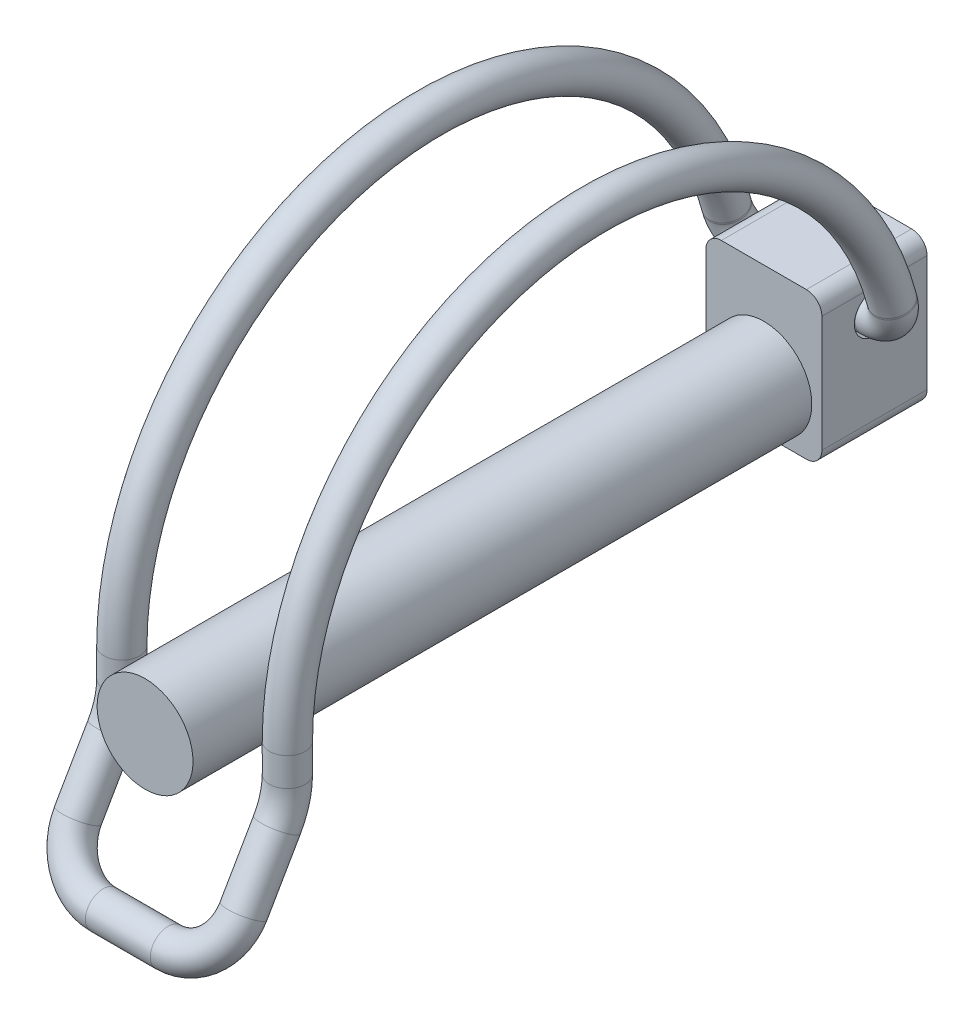
ISO-10303-21;
HEADER;
FILE_DESCRIPTION(('STEP AP214'),'2;1');
FILE_NAME('part.step','',(''),(''),'','','');
FILE_SCHEMA(('AUTOMOTIVE_DESIGN { 1 0 10303 214 1 1 1 1 }'));
ENDSEC;
DATA;
#1=APPLICATION_CONTEXT('core data for automotive mechanical design processes');
#2=APPLICATION_PROTOCOL_DEFINITION('international standard','automotive_design',2000,#1);
#3=PRODUCT_CONTEXT('',#1,'mechanical');
#4=PRODUCT('Part','Part','',(#3));
#5=PRODUCT_RELATED_PRODUCT_CATEGORY('part','',(#4));
#6=PRODUCT_DEFINITION_FORMATION('','',#4);
#7=PRODUCT_DEFINITION_CONTEXT('part definition',#1,'design');
#8=PRODUCT_DEFINITION('design','',#6,#7);
#9=PRODUCT_DEFINITION_SHAPE('','',#8);
#10=(LENGTH_UNIT() NAMED_UNIT(*) SI_UNIT(.MILLI.,.METRE.));
#11=(NAMED_UNIT(*) PLANE_ANGLE_UNIT() SI_UNIT($,.RADIAN.));
#12=(NAMED_UNIT(*) SI_UNIT($,.STERADIAN.) SOLID_ANGLE_UNIT());
#13=UNCERTAINTY_MEASURE_WITH_UNIT(LENGTH_MEASURE(1.E-05),#10,'distance_accuracy_value','');
#14=(GEOMETRIC_REPRESENTATION_CONTEXT(3) GLOBAL_UNCERTAINTY_ASSIGNED_CONTEXT((#13)) GLOBAL_UNIT_ASSIGNED_CONTEXT((#10,
#11,#12)) REPRESENTATION_CONTEXT('',''));
#15=CARTESIAN_POINT('',(0.,0.,0.));
#16=DIRECTION('',(0.,0.,1.));
#17=DIRECTION('',(1.,0.,0.));
#18=AXIS2_PLACEMENT_3D('',#15,#16,#17);
#19=CARTESIAN_POINT('',(4.6355,6.8479338589581,-3.75920968162365));
#20=DIRECTION('',(0.,0.258819045102516,-0.96592582628907));
#21=DIRECTION('',(0.,0.96592582628907,0.258819045102516));
#22=AXIS2_PLACEMENT_3D('',#19,#20,#21);
#23=TOROIDAL_SURFACE('',#22,2.159,1.4605);
#24=CARTESIAN_POINT('',(6.7945,6.8479338589581,-3.75920968162366));
#25=DIRECTION('',(0.,0.965925826289069,0.258819045102517));
#26=DIRECTION('',(0.258819045102516,0.249999999999996,-0.933012701892222));
#27=AXIS2_PLACEMENT_3D('',#24,#25,#26);
#28=CIRCLE('',#27,1.4605);
#29=CARTESIAN_POINT('',(8.255,6.84793385895809,-3.75920968162366));
#30=VERTEX_POINT('',#29);
#31=EDGE_CURVE('E46',#30,#30,#28,.T.);
#32=CARTESIAN_POINT('',(4.6355,4.7625,-4.31799999999999));
#33=DIRECTION('',(1.,0.,0.));
#34=DIRECTION('',(0.,0.,-1.));
#35=AXIS2_PLACEMENT_3D('',#32,#33,#34);
#36=CIRCLE('',#35,1.4605);
#37=CARTESIAN_POINT('',(4.6355,3.35176533070481,-4.69600521537221));
#38=VERTEX_POINT('',#37);
#39=EDGE_CURVE('E11',#38,#38,#36,.T.);
#40=CARTESIAN_POINT('',(4.6355,6.8479338589581,-3.75920968162365));
#41=DIRECTION('',(0.,0.258819045102516,-0.96592582628907));
#42=DIRECTION('',(0.,0.96592582628907,0.258819045102516));
#43=AXIS2_PLACEMENT_3D('',#40,#41,#42);
#44=CIRCLE('',#43,3.6195);
#45=EDGE_CURVE('',#30,#38,#44,.T.);
#46=ORIENTED_EDGE('',*,*,#31,.F.);
#47=ORIENTED_EDGE('',*,*,#39,.T.);
#48=ORIENTED_EDGE('',*,*,#45,.T.);
#49=ORIENTED_EDGE('',*,*,#45,.F.);
#50=EDGE_LOOP('',(#46,#48,#47,#49));
#51=FACE_BOUND('',#50,.T.);
#52=ADVANCED_FACE('F40',(#51),#23,.T.);
#53=CARTESIAN_POINT('',(6.7945,6.97060643889681,-3.72633966289564));
#54=DIRECTION('',(0.,-0.965925826289087,-0.258819045102452));
#55=DIRECTION('',(0.,0.258819045102452,-0.965925826289087));
#56=AXIS2_PLACEMENT_3D('',#53,#54,#55);
#57=CYLINDRICAL_SURFACE('',#56,1.4605);
#58=CARTESIAN_POINT('',(6.7945,6.97060643889681,-3.72633966289564));
#59=DIRECTION('',(0.,0.965925826289069,0.258819045102517));
#60=DIRECTION('',(0.258819045102516,0.249999999999996,-0.933012701892222));
#61=AXIS2_PLACEMENT_3D('',#58,#59,#60);
#62=CIRCLE('',#61,1.4605);
#63=CARTESIAN_POINT('',(6.7945,7.34861165426904,-5.13707433219084));
#64=VERTEX_POINT('',#63);
#65=EDGE_CURVE('E50',#64,#64,#62,.T.);
#66=ORIENTED_EDGE('',*,*,#65,.F.);
#67=EDGE_LOOP('',(#66));
#68=FACE_BOUND('',#67,.T.);
#69=ORIENTED_EDGE('',*,*,#31,.T.);
#70=EDGE_LOOP('',(#69));
#71=FACE_BOUND('',#70,.T.);
#72=ADVANCED_FACE('F174',(#68,#71),#57,.T.);
#73=CARTESIAN_POINT('',(6.7945,0.435792524931649,20.661917882031));
#74=DIRECTION('',(-1.,0.,0.));
#75=DIRECTION('',(0.,0.,1.));
#76=AXIS2_PLACEMENT_3D('',#73,#74,#75);
#77=TOROIDAL_SURFACE('',#76,25.248582117969,1.4605);
#78=CARTESIAN_POINT('',(6.7945,0.43579252493166,45.9105));
#79=DIRECTION('',(0.,-1.,0.));
#80=DIRECTION('',(0.258819045102516,0.,0.965925826289069));
#81=AXIS2_PLACEMENT_3D('',#78,#79,#80);
#82=CIRCLE('',#81,1.4605);
#83=CARTESIAN_POINT('',(6.7945,0.435792524931661,47.371));
#84=VERTEX_POINT('',#83);
#85=EDGE_CURVE('E54',#84,#84,#82,.T.);
#86=CARTESIAN_POINT('',(6.7945,0.435792524931649,20.661917882031));
#87=DIRECTION('',(-1.,0.,0.));
#88=DIRECTION('',(0.,0.,1.));
#89=AXIS2_PLACEMENT_3D('',#86,#87,#88);
#90=CIRCLE('',#89,26.709082117969);
#91=EDGE_CURVE('',#84,#64,#90,.T.);
#92=ORIENTED_EDGE('',*,*,#85,.F.);
#93=ORIENTED_EDGE('',*,*,#65,.T.);
#94=ORIENTED_EDGE('',*,*,#91,.T.);
#95=ORIENTED_EDGE('',*,*,#91,.F.);
#96=EDGE_LOOP('',(#92,#94,#93,#95));
#97=FACE_BOUND('',#96,.T.);
#98=ADVANCED_FACE('F168',(#97),#77,.T.);
#99=CARTESIAN_POINT('',(6.7945,-1.905,45.9105));
#100=DIRECTION('',(0.,1.,0.));
#101=DIRECTION('',(0.,0.,1.));
#102=AXIS2_PLACEMENT_3D('',#99,#100,#101);
#103=CYLINDRICAL_SURFACE('',#102,1.4605);
#104=CARTESIAN_POINT('',(6.7945,-1.905,45.9105));
#105=DIRECTION('',(0.,-1.,0.));
#106=DIRECTION('',(0.258819045102516,0.,0.965925826289069));
#107=AXIS2_PLACEMENT_3D('',#104,#105,#106);
#108=CIRCLE('',#107,1.4605);
#109=CARTESIAN_POINT('',(6.7945,-1.905,44.45));
#110=VERTEX_POINT('',#109);
#111=EDGE_CURVE('E59',#110,#110,#108,.T.);
#112=ORIENTED_EDGE('',*,*,#111,.F.);
#113=EDGE_LOOP('',(#112));
#114=FACE_BOUND('',#113,.T.);
#115=ORIENTED_EDGE('',*,*,#85,.T.);
#116=EDGE_LOOP('',(#115));
#117=FACE_BOUND('',#116,.T.);
#118=ADVANCED_FACE('F162',(#114,#117),#103,.T.);
#119=CARTESIAN_POINT('',(6.7945,-1.90500000000001,52.2605));
#120=DIRECTION('',(1.,0.,0.));
#121=DIRECTION('',(0.,0.,-1.));
#122=AXIS2_PLACEMENT_3D('',#119,#120,#121);
#123=TOROIDAL_SURFACE('',#122,6.35000000000001,1.4605);
#124=CARTESIAN_POINT('',(6.7945,-5.08000000000002,46.7612386859688));
#125=DIRECTION('',(0.,-0.866025403784439,0.5));
#126=DIRECTION('',(0.258819045102516,0.482962913144536,0.836516303737808));
#127=AXIS2_PLACEMENT_3D('',#124,#125,#126);
#128=CIRCLE('',#127,1.4605);
#129=CARTESIAN_POINT('',(6.7945,-5.81025000000002,45.4964085837416));
#130=VERTEX_POINT('',#129);
#131=EDGE_CURVE('E62',#130,#130,#128,.T.);
#132=CARTESIAN_POINT('',(6.7945,-1.90500000000001,52.2605));
#133=DIRECTION('',(1.,0.,0.));
#134=DIRECTION('',(0.,0.,-1.));
#135=AXIS2_PLACEMENT_3D('',#132,#133,#134);
#136=CIRCLE('',#135,7.81050000000001);
#137=EDGE_CURVE('',#130,#110,#136,.T.);
#138=ORIENTED_EDGE('',*,*,#131,.F.);
#139=ORIENTED_EDGE('',*,*,#111,.T.);
#140=ORIENTED_EDGE('',*,*,#137,.T.);
#141=ORIENTED_EDGE('',*,*,#137,.F.);
#142=EDGE_LOOP('',(#138,#140,#139,#141));
#143=FACE_BOUND('',#142,.T.);
#144=ADVANCED_FACE('F156',(#143),#123,.T.);
#145=CARTESIAN_POINT('',(6.7945,-9.84249999999998,49.5108693429844));
#146=DIRECTION('',(0.,0.866025403784435,-0.500000000000007));
#147=DIRECTION('',(0.,0.500000000000007,0.866025403784435));
#148=AXIS2_PLACEMENT_3D('',#145,#146,#147);
#149=CYLINDRICAL_SURFACE('',#148,1.4605);
#150=CARTESIAN_POINT('',(6.7945,-9.84249999999998,49.5108693429844));
#151=DIRECTION('',(0.,-0.866025403784439,0.5));
#152=DIRECTION('',(0.258819045102516,0.482962913144536,0.836516303737808));
#153=AXIS2_PLACEMENT_3D('',#150,#151,#152);
#154=CIRCLE('',#153,1.4605);
#155=CARTESIAN_POINT('',(8.255,-9.84249999999998,49.5108693429844));
#156=VERTEX_POINT('',#155);
#157=EDGE_CURVE('E65',#156,#156,#154,.T.);
#158=ORIENTED_EDGE('',*,*,#157,.F.);
#159=EDGE_LOOP('',(#158));
#160=FACE_BOUND('',#159,.T.);
#161=ORIENTED_EDGE('',*,*,#131,.T.);
#162=EDGE_LOOP('',(#161));
#163=FACE_BOUND('',#162,.T.);
#164=ADVANCED_FACE('F150',(#160,#163),#149,.T.);
#165=CARTESIAN_POINT('',(2.667,-9.8425,49.5108693429844));
#166=DIRECTION('',(0.,0.5,0.866025403784438));
#167=DIRECTION('',(0.,-0.866025403784439,0.5));
#168=AXIS2_PLACEMENT_3D('',#165,#166,#167);
#169=TOROIDAL_SURFACE('',#168,4.12749999999999,1.4605);
#170=CARTESIAN_POINT('',(2.667,-13.4170198541203,51.5746193429844));
#171=DIRECTION('',(-1.,0.,0.));
#172=DIRECTION('',(0.,0.258819045102526,0.965925826289067));
#173=AXIS2_PLACEMENT_3D('',#170,#171,#172);
#174=CIRCLE('',#173,1.4605);
#175=CARTESIAN_POINT('',(2.667,-14.6818499563474,52.3048693429844));
#176=VERTEX_POINT('',#175);
#177=EDGE_CURVE('E68',#176,#176,#174,.T.);
#178=CARTESIAN_POINT('',(2.667,-9.8425,49.5108693429844));
#179=DIRECTION('',(0.,0.5,0.866025403784438));
#180=DIRECTION('',(0.,-0.866025403784439,0.5));
#181=AXIS2_PLACEMENT_3D('',#178,#179,#180);
#182=CIRCLE('',#181,5.58799999999999);
#183=EDGE_CURVE('',#176,#156,#182,.T.);
#184=ORIENTED_EDGE('',*,*,#177,.F.);
#185=ORIENTED_EDGE('',*,*,#157,.T.);
#186=ORIENTED_EDGE('',*,*,#183,.T.);
#187=ORIENTED_EDGE('',*,*,#183,.F.);
#188=EDGE_LOOP('',(#184,#186,#185,#187));
#189=FACE_BOUND('',#188,.T.);
#190=ADVANCED_FACE('F144',(#189),#169,.T.);
#191=CARTESIAN_POINT('',(-2.66700000000001,-13.4170198541203,51.5746193429844));
#192=DIRECTION('',(1.,0.,0.));
#193=DIRECTION('',(0.,0.,-1.));
#194=AXIS2_PLACEMENT_3D('',#191,#192,#193);
#195=CYLINDRICAL_SURFACE('',#194,1.4605);
#196=CARTESIAN_POINT('',(-2.66700000000001,-13.4170198541203,51.5746193429844));
#197=DIRECTION('',(-1.,0.,0.));
#198=DIRECTION('',(0.,0.258819045102526,0.965925826289067));
#199=AXIS2_PLACEMENT_3D('',#196,#197,#198);
#200=CIRCLE('',#199,1.4605);
#201=CARTESIAN_POINT('',(-2.66700000000001,-14.6818499563474,52.3048693429844));
#202=VERTEX_POINT('',#201);
#203=EDGE_CURVE('E71',#202,#202,#200,.T.);
#204=ORIENTED_EDGE('',*,*,#203,.F.);
#205=EDGE_LOOP('',(#204));
#206=FACE_BOUND('',#205,.T.);
#207=ORIENTED_EDGE('',*,*,#177,.T.);
#208=EDGE_LOOP('',(#207));
#209=FACE_BOUND('',#208,.T.);
#210=ADVANCED_FACE('F138',(#206,#209),#195,.T.);
#211=CARTESIAN_POINT('',(-2.66700000000001,-9.8425,49.5108693429844));
#212=DIRECTION('',(0.,0.5,0.866025403784438));
#213=DIRECTION('',(0.,-0.866025403784439,0.5));
#214=AXIS2_PLACEMENT_3D('',#211,#212,#213);
#215=TOROIDAL_SURFACE('',#214,4.12749999999999,1.4605);
#216=CARTESIAN_POINT('',(-6.7945,-9.8425,49.5108693429844));
#217=DIRECTION('',(0.,0.866025403784438,-0.5));
#218=DIRECTION('',(-0.258819045102516,0.482962913144535,0.836516303737809));
#219=AXIS2_PLACEMENT_3D('',#216,#217,#218);
#220=CIRCLE('',#219,1.4605);
#221=CARTESIAN_POINT('',(-8.255,-9.8425,49.5108693429844));
#222=VERTEX_POINT('',#221);
#223=EDGE_CURVE('E74',#222,#222,#220,.T.);
#224=CARTESIAN_POINT('',(-2.66700000000001,-9.8425,49.5108693429844));
#225=DIRECTION('',(0.,0.5,0.866025403784438));
#226=DIRECTION('',(0.,-0.866025403784439,0.5));
#227=AXIS2_PLACEMENT_3D('',#224,#225,#226);
#228=CIRCLE('',#227,5.58799999999999);
#229=EDGE_CURVE('',#222,#202,#228,.T.);
#230=ORIENTED_EDGE('',*,*,#223,.F.);
#231=ORIENTED_EDGE('',*,*,#203,.T.);
#232=ORIENTED_EDGE('',*,*,#229,.T.);
#233=ORIENTED_EDGE('',*,*,#229,.F.);
#234=EDGE_LOOP('',(#230,#232,#231,#233));
#235=FACE_BOUND('',#234,.T.);
#236=ADVANCED_FACE('F132',(#235),#215,.T.);
#237=CARTESIAN_POINT('',(-6.7945,-5.08000000000003,46.7612386859688));
#238=DIRECTION('',(0.,-0.866025403784435,0.500000000000007));
#239=DIRECTION('',(0.,-0.500000000000007,-0.866025403784435));
#240=AXIS2_PLACEMENT_3D('',#237,#238,#239);
#241=CYLINDRICAL_SURFACE('',#240,1.4605);
#242=CARTESIAN_POINT('',(-6.7945,-5.08000000000003,46.7612386859688));
#243=DIRECTION('',(0.,0.866025403784438,-0.5));
#244=DIRECTION('',(-0.258819045102516,0.482962913144535,0.836516303737809));
#245=AXIS2_PLACEMENT_3D('',#242,#243,#244);
#246=CIRCLE('',#245,1.4605);
#247=CARTESIAN_POINT('',(-6.7945,-5.81025000000003,45.4964085837416));
#248=VERTEX_POINT('',#247);
#249=EDGE_CURVE('E77',#248,#248,#246,.T.);
#250=ORIENTED_EDGE('',*,*,#249,.F.);
#251=EDGE_LOOP('',(#250));
#252=FACE_BOUND('',#251,.T.);
#253=ORIENTED_EDGE('',*,*,#223,.T.);
#254=EDGE_LOOP('',(#253));
#255=FACE_BOUND('',#254,.T.);
#256=ADVANCED_FACE('F126',(#252,#255),#241,.T.);
#257=CARTESIAN_POINT('',(-6.7945,-1.90500000000001,52.2605));
#258=DIRECTION('',(-1.,0.,0.));
#259=DIRECTION('',(0.,0.,1.));
#260=AXIS2_PLACEMENT_3D('',#257,#258,#259);
#261=TOROIDAL_SURFACE('',#260,6.35000000000001,1.4605);
#262=CARTESIAN_POINT('',(-6.7945,-1.90500000000001,45.9105));
#263=DIRECTION('',(0.,1.,0.));
#264=DIRECTION('',(-0.258819045102516,0.,0.96592582628907));
#265=AXIS2_PLACEMENT_3D('',#262,#263,#264);
#266=CIRCLE('',#265,1.4605);
#267=CARTESIAN_POINT('',(-6.7945,-1.90500000000001,44.45));
#268=VERTEX_POINT('',#267);
#269=EDGE_CURVE('E80',#268,#268,#266,.T.);
#270=CARTESIAN_POINT('',(-6.7945,-1.90500000000001,52.2605));
#271=DIRECTION('',(-1.,0.,0.));
#272=DIRECTION('',(0.,0.,1.));
#273=AXIS2_PLACEMENT_3D('',#270,#271,#272);
#274=CIRCLE('',#273,7.81050000000001);
#275=EDGE_CURVE('',#268,#248,#274,.T.);
#276=ORIENTED_EDGE('',*,*,#269,.F.);
#277=ORIENTED_EDGE('',*,*,#249,.T.);
#278=ORIENTED_EDGE('',*,*,#275,.T.);
#279=ORIENTED_EDGE('',*,*,#275,.F.);
#280=EDGE_LOOP('',(#276,#278,#277,#279));
#281=FACE_BOUND('',#280,.T.);
#282=ADVANCED_FACE('F120',(#281),#261,.T.);
#283=CARTESIAN_POINT('',(-6.7945,0.435792524931646,45.9105));
#284=DIRECTION('',(0.,-1.,0.));
#285=DIRECTION('',(0.,0.,-1.));
#286=AXIS2_PLACEMENT_3D('',#283,#284,#285);
#287=CYLINDRICAL_SURFACE('',#286,1.4605);
#288=CARTESIAN_POINT('',(-6.7945,0.435792524931646,45.9105));
#289=DIRECTION('',(0.,1.,0.));
#290=DIRECTION('',(-0.258819045102516,0.,0.96592582628907));
#291=AXIS2_PLACEMENT_3D('',#288,#289,#290);
#292=CIRCLE('',#291,1.4605);
#293=CARTESIAN_POINT('',(-6.7945,0.435792524931646,47.371));
#294=VERTEX_POINT('',#293);
#295=EDGE_CURVE('E83',#294,#294,#292,.T.);
#296=ORIENTED_EDGE('',*,*,#295,.F.);
#297=EDGE_LOOP('',(#296));
#298=FACE_BOUND('',#297,.T.);
#299=ORIENTED_EDGE('',*,*,#269,.T.);
#300=EDGE_LOOP('',(#299));
#301=FACE_BOUND('',#300,.T.);
#302=ADVANCED_FACE('F114',(#298,#301),#287,.T.);
#303=CARTESIAN_POINT('',(-6.7945,0.435792524931649,20.661917882031));
#304=DIRECTION('',(1.,0.,0.));
#305=DIRECTION('',(0.,0.,-1.));
#306=AXIS2_PLACEMENT_3D('',#303,#304,#305);
#307=TOROIDAL_SURFACE('',#306,25.248582117969,1.4605);
#308=CARTESIAN_POINT('',(-6.7945,6.97060643889681,-3.72633966289565));
#309=DIRECTION('',(0.,-0.96592582628907,-0.258819045102516));
#310=DIRECTION('',(-0.258819045102516,0.249999999999995,-0.933012701892222));
#311=AXIS2_PLACEMENT_3D('',#308,#309,#310);
#312=CIRCLE('',#311,1.4605);
#313=CARTESIAN_POINT('',(-6.7945,7.34861165426904,-5.13707433219084));
#314=VERTEX_POINT('',#313);
#315=EDGE_CURVE('E86',#314,#314,#312,.T.);
#316=CARTESIAN_POINT('',(-6.7945,0.435792524931649,20.661917882031));
#317=DIRECTION('',(1.,0.,0.));
#318=DIRECTION('',(0.,0.,-1.));
#319=AXIS2_PLACEMENT_3D('',#316,#317,#318);
#320=CIRCLE('',#319,26.709082117969);
#321=EDGE_CURVE('',#314,#294,#320,.T.);
#322=ORIENTED_EDGE('',*,*,#315,.F.);
#323=ORIENTED_EDGE('',*,*,#295,.T.);
#324=ORIENTED_EDGE('',*,*,#321,.T.);
#325=ORIENTED_EDGE('',*,*,#321,.F.);
#326=EDGE_LOOP('',(#322,#324,#323,#325));
#327=FACE_BOUND('',#326,.T.);
#328=ADVANCED_FACE('F108',(#327),#307,.T.);
#329=CARTESIAN_POINT('',(-6.7945,6.8479338589581,-3.75920968162367));
#330=DIRECTION('',(0.,0.96592582628907,0.258819045102514));
#331=DIRECTION('',(0.,-0.258819045102514,0.96592582628907));
#332=AXIS2_PLACEMENT_3D('',#329,#330,#331);
#333=CYLINDRICAL_SURFACE('',#332,1.4605);
#334=CARTESIAN_POINT('',(-6.7945,6.8479338589581,-3.75920968162367));
#335=DIRECTION('',(0.,-0.96592582628907,-0.258819045102516));
#336=DIRECTION('',(-0.258819045102516,0.249999999999995,-0.933012701892222));
#337=AXIS2_PLACEMENT_3D('',#334,#335,#336);
#338=CIRCLE('',#337,1.4605);
#339=CARTESIAN_POINT('',(-8.255,6.8479338589581,-3.75920968162367));
#340=VERTEX_POINT('',#339);
#341=EDGE_CURVE('E89',#340,#340,#338,.T.);
#342=ORIENTED_EDGE('',*,*,#341,.F.);
#343=EDGE_LOOP('',(#342));
#344=FACE_BOUND('',#343,.T.);
#345=ORIENTED_EDGE('',*,*,#315,.T.);
#346=EDGE_LOOP('',(#345));
#347=FACE_BOUND('',#346,.T.);
#348=ADVANCED_FACE('F102',(#344,#347),#333,.T.);
#349=CARTESIAN_POINT('',(-4.6355,6.8479338589581,-3.75920968162367));
#350=DIRECTION('',(0.,0.258819045102516,-0.96592582628907));
#351=DIRECTION('',(0.,0.96592582628907,0.258819045102516));
#352=AXIS2_PLACEMENT_3D('',#349,#350,#351);
#353=TOROIDAL_SURFACE('',#352,2.159,1.4605);
#354=CARTESIAN_POINT('',(-4.6355,4.7625,-4.318));
#355=DIRECTION('',(1.,0.,0.));
#356=DIRECTION('',(0.,0.,-1.));
#357=AXIS2_PLACEMENT_3D('',#354,#355,#356);
#358=CIRCLE('',#357,1.4605);
#359=CARTESIAN_POINT('',(-4.6355,3.35176533070481,-4.69600521537222));
#360=VERTEX_POINT('',#359);
#361=EDGE_CURVE('E92',#360,#360,#358,.T.);
#362=CARTESIAN_POINT('',(-4.6355,6.8479338589581,-3.75920968162367));
#363=DIRECTION('',(0.,0.258819045102516,-0.96592582628907));
#364=DIRECTION('',(0.,0.96592582628907,0.258819045102516));
#365=AXIS2_PLACEMENT_3D('',#362,#363,#364);
#366=CIRCLE('',#365,3.6195);
#367=EDGE_CURVE('',#360,#340,#366,.T.);
#368=ORIENTED_EDGE('',*,*,#361,.F.);
#369=ORIENTED_EDGE('',*,*,#341,.T.);
#370=ORIENTED_EDGE('',*,*,#367,.T.);
#371=ORIENTED_EDGE('',*,*,#367,.F.);
#372=EDGE_LOOP('',(#368,#370,#369,#371));
#373=FACE_BOUND('',#372,.T.);
#374=ADVANCED_FACE('F99',(#373),#353,.T.);
#375=CARTESIAN_POINT('',(-4.6355,4.7625,-4.318));
#376=DIRECTION('',(1.,0.,0.));
#377=DIRECTION('',(0.,0.,-1.));
#378=AXIS2_PLACEMENT_3D('',#375,#376,#377);
#379=CYLINDRICAL_SURFACE('',#378,1.4605);
#380=ORIENTED_EDGE('',*,*,#361,.T.);
#381=EDGE_LOOP('',(#380));
#382=FACE_BOUND('',#381,.T.);
#383=ORIENTED_EDGE('',*,*,#39,.F.);
#384=EDGE_LOOP('',(#383));
#385=FACE_BOUND('',#384,.T.);
#386=ADVANCED_FACE('F96',(#382,#385),#379,.T.);
#387=CLOSED_SHELL('',(#52,#72,#98,#118,#144,#164,#190,#210,#236,#256,#282,#302,#328,#348,#374,#386));
#388=MANIFOLD_SOLID_BREP('B2',#387);
#389=CARTESIAN_POINT('',(0.,0.,50.8));
#390=DIRECTION('',(0.,0.,-1.));
#391=DIRECTION('',(-1.,0.,0.));
#392=AXIS2_PLACEMENT_3D('',#389,#390,#391);
#393=CYLINDRICAL_SURFACE('',#392,3.937);
#394=CARTESIAN_POINT('',(0.,0.,50.8));
#395=DIRECTION('',(0.,0.,1.));
#396=DIRECTION('',(1.,0.,0.));
#397=AXIS2_PLACEMENT_3D('',#394,#395,#396);
#398=CIRCLE('',#397,3.937);
#399=CARTESIAN_POINT('',(3.937,0.,50.8));
#400=VERTEX_POINT('',#399);
#401=EDGE_CURVE('E38',#400,#400,#398,.T.);
#402=ORIENTED_EDGE('',*,*,#401,.F.);
#403=EDGE_LOOP('',(#402));
#404=FACE_BOUND('',#403,.T.);
#405=CARTESIAN_POINT('',(0.,0.,0.));
#406=DIRECTION('',(0.,0.,-1.));
#407=DIRECTION('',(-1.,0.,0.));
#408=AXIS2_PLACEMENT_3D('',#405,#406,#407);
#409=CIRCLE('',#408,3.937);
#410=CARTESIAN_POINT('',(-3.937,0.,0.));
#411=VERTEX_POINT('',#410);
#412=EDGE_CURVE('E292',#411,#411,#409,.T.);
#413=ORIENTED_EDGE('',*,*,#412,.F.);
#414=EDGE_LOOP('',(#413));
#415=FACE_BOUND('',#414,.T.);
#416=ADVANCED_FACE('F284',(#404,#415),#393,.T.);
#417=CARTESIAN_POINT('',(0.,0.,50.8));
#418=DIRECTION('',(0.,0.,1.));
#419=DIRECTION('',(1.,0.,0.));
#420=AXIS2_PLACEMENT_3D('',#417,#418,#419);
#421=PLANE('',#420);
#422=ORIENTED_EDGE('',*,*,#401,.T.);
#423=EDGE_LOOP('',(#422));
#424=FACE_BOUND('',#423,.T.);
#425=ADVANCED_FACE('F416',(#424),#421,.T.);
#426=CARTESIAN_POINT('',(3.4925,-2.8575,0.));
#427=DIRECTION('',(0.,0.,-1.));
#428=DIRECTION('',(-1.,0.,0.));
#429=AXIS2_PLACEMENT_3D('',#426,#427,#428);
#430=PLANE('',#429);
#431=CARTESIAN_POINT('',(3.4925,-2.8575,0.));
#432=DIRECTION('',(0.,0.,-1.));
#433=DIRECTION('',(-1.,0.,0.));
#434=AXIS2_PLACEMENT_3D('',#431,#432,#433);
#435=CIRCLE('',#434,1.27);
#436=CARTESIAN_POINT('',(4.7625,-2.8575,0.));
#437=VERTEX_POINT('',#436);
#438=CARTESIAN_POINT('',(3.4925,-4.1275,0.));
#439=VERTEX_POINT('',#438);
#440=EDGE_CURVE('E381',#437,#439,#435,.T.);
#441=ORIENTED_EDGE('',*,*,#440,.F.);
#442=DIRECTION('',(0.,-1.,0.));
#443=VECTOR('',#442,1.);
#444=CARTESIAN_POINT('',(4.7625,6.6675,0.));
#445=LINE('',#444,#443);
#446=CARTESIAN_POINT('',(4.7625,6.6675,0.));
#447=VERTEX_POINT('',#446);
#448=EDGE_CURVE('E335',#447,#437,#445,.T.);
#449=ORIENTED_EDGE('',*,*,#448,.F.);
#450=CARTESIAN_POINT('',(3.4925,6.6675,0.));
#451=DIRECTION('',(0.,0.,-1.));
#452=DIRECTION('',(-1.,0.,0.));
#453=AXIS2_PLACEMENT_3D('',#450,#451,#452);
#454=CIRCLE('',#453,1.27);
#455=CARTESIAN_POINT('',(3.4925,7.9375,0.));
#456=VERTEX_POINT('',#455);
#457=EDGE_CURVE('E329',#456,#447,#454,.T.);
#458=ORIENTED_EDGE('',*,*,#457,.F.);
#459=DIRECTION('',(1.,0.,0.));
#460=VECTOR('',#459,1.);
#461=CARTESIAN_POINT('',(3.4925,7.9375,0.));
#462=LINE('',#461,#460);
#463=CARTESIAN_POINT('',(-3.4925,7.9375,0.));
#464=VERTEX_POINT('',#463);
#465=EDGE_CURVE('E371',#464,#456,#462,.T.);
#466=ORIENTED_EDGE('',*,*,#465,.F.);
#467=CARTESIAN_POINT('',(-3.4925,6.6675,0.));
#468=DIRECTION('',(0.,0.,-1.));
#469=DIRECTION('',(1.,0.,0.));
#470=AXIS2_PLACEMENT_3D('',#467,#468,#469);
#471=CIRCLE('',#470,1.27);
#472=CARTESIAN_POINT('',(-4.7625,6.6675,0.));
#473=VERTEX_POINT('',#472);
#474=EDGE_CURVE('E391',#473,#464,#471,.T.);
#475=ORIENTED_EDGE('',*,*,#474,.F.);
#476=DIRECTION('',(0.,1.,0.));
#477=VECTOR('',#476,1.);
#478=CARTESIAN_POINT('',(-4.7625,6.6675,0.));
#479=LINE('',#478,#477);
#480=CARTESIAN_POINT('',(-4.7625,-2.8575,0.));
#481=VERTEX_POINT('',#480);
#482=EDGE_CURVE('E389',#481,#473,#479,.T.);
#483=ORIENTED_EDGE('',*,*,#482,.F.);
#484=CARTESIAN_POINT('',(-3.4925,-2.8575,0.));
#485=DIRECTION('',(0.,0.,-1.));
#486=DIRECTION('',(-1.,0.,0.));
#487=AXIS2_PLACEMENT_3D('',#484,#485,#486);
#488=CIRCLE('',#487,1.27);
#489=CARTESIAN_POINT('',(-3.4925,-4.1275,0.));
#490=VERTEX_POINT('',#489);
#491=EDGE_CURVE('E387',#490,#481,#488,.T.);
#492=ORIENTED_EDGE('',*,*,#491,.F.);
#493=DIRECTION('',(-1.,0.,0.));
#494=VECTOR('',#493,1.);
#495=CARTESIAN_POINT('',(3.4925,-4.1275,0.));
#496=LINE('',#495,#494);
#497=EDGE_CURVE('E384',#439,#490,#496,.T.);
#498=ORIENTED_EDGE('',*,*,#497,.F.);
#499=EDGE_LOOP('',(#441,#449,#458,#466,#475,#483,#492,#498));
#500=FACE_BOUND('',#499,.T.);
#501=ORIENTED_EDGE('',*,*,#412,.T.);
#502=EDGE_LOOP('',(#501));
#503=FACE_BOUND('',#502,.T.);
#504=ADVANCED_FACE('F413',(#500,#503),#430,.F.);
#505=CARTESIAN_POINT('',(3.4925,-2.8575,-8.636));
#506=DIRECTION('',(0.,0.,1.));
#507=DIRECTION('',(1.,0.,0.));
#508=AXIS2_PLACEMENT_3D('',#505,#506,#507);
#509=CYLINDRICAL_SURFACE('',#508,1.27);
#510=ORIENTED_EDGE('',*,*,#440,.T.);
#511=DIRECTION('',(0.,0.,1.));
#512=VECTOR('',#511,1.);
#513=CARTESIAN_POINT('',(3.4925,-4.1275,-8.636));
#514=LINE('',#513,#512);
#515=CARTESIAN_POINT('',(3.4925,-4.1275,-8.636));
#516=VERTEX_POINT('',#515);
#517=EDGE_CURVE('E409',#516,#439,#514,.T.);
#518=ORIENTED_EDGE('',*,*,#517,.F.);
#519=CARTESIAN_POINT('',(3.4925,-2.8575,-8.636));
#520=DIRECTION('',(0.,0.,-1.));
#521=DIRECTION('',(-1.,0.,0.));
#522=AXIS2_PLACEMENT_3D('',#519,#520,#521);
#523=CIRCLE('',#522,1.27);
#524=CARTESIAN_POINT('',(4.7625,-2.8575,-8.636));
#525=VERTEX_POINT('',#524);
#526=EDGE_CURVE('E396',#525,#516,#523,.T.);
#527=ORIENTED_EDGE('',*,*,#526,.F.);
#528=DIRECTION('',(0.,0.,1.));
#529=VECTOR('',#528,1.);
#530=CARTESIAN_POINT('',(4.7625,-2.8575,-8.636));
#531=LINE('',#530,#529);
#532=EDGE_CURVE('E377',#525,#437,#531,.T.);
#533=ORIENTED_EDGE('',*,*,#532,.T.);
#534=EDGE_LOOP('',(#510,#518,#527,#533));
#535=FACE_BOUND('',#534,.T.);
#536=ADVANCED_FACE('F426',(#535),#509,.T.);
#537=CARTESIAN_POINT('',(3.4925,-4.1275,-8.636));
#538=DIRECTION('',(0.,1.,0.));
#539=DIRECTION('',(-1.,0.,0.));
#540=AXIS2_PLACEMENT_3D('',#537,#538,#539);
#541=PLANE('',#540);
#542=ORIENTED_EDGE('',*,*,#497,.T.);
#543=DIRECTION('',(0.,0.,1.));
#544=VECTOR('',#543,1.);
#545=CARTESIAN_POINT('',(-3.4925,-4.1275,-8.636));
#546=LINE('',#545,#544);
#547=CARTESIAN_POINT('',(-3.4925,-4.1275,-8.636));
#548=VERTEX_POINT('',#547);
#549=EDGE_CURVE('E406',#548,#490,#546,.T.);
#550=ORIENTED_EDGE('',*,*,#549,.F.);
#551=DIRECTION('',(-1.,0.,0.));
#552=VECTOR('',#551,1.);
#553=CARTESIAN_POINT('',(3.4925,-4.1275,-8.636));
#554=LINE('',#553,#552);
#555=EDGE_CURVE('E344',#516,#548,#554,.T.);
#556=ORIENTED_EDGE('',*,*,#555,.F.);
#557=ORIENTED_EDGE('',*,*,#517,.T.);
#558=EDGE_LOOP('',(#542,#550,#556,#557));
#559=FACE_BOUND('',#558,.T.);
#560=ADVANCED_FACE('F432',(#559),#541,.F.);
#561=CARTESIAN_POINT('',(-3.4925,-2.8575,-8.636));
#562=DIRECTION('',(0.,0.,1.));
#563=DIRECTION('',(1.,0.,0.));
#564=AXIS2_PLACEMENT_3D('',#561,#562,#563);
#565=CYLINDRICAL_SURFACE('',#564,1.27);
#566=ORIENTED_EDGE('',*,*,#491,.T.);
#567=DIRECTION('',(0.,0.,1.));
#568=VECTOR('',#567,1.);
#569=CARTESIAN_POINT('',(-4.7625,-2.8575,-8.636));
#570=LINE('',#569,#568);
#571=CARTESIAN_POINT('',(-4.7625,-2.8575,-8.636));
#572=VERTEX_POINT('',#571);
#573=EDGE_CURVE('E403',#572,#481,#570,.T.);
#574=ORIENTED_EDGE('',*,*,#573,.F.);
#575=CARTESIAN_POINT('',(-3.4925,-2.8575,-8.636));
#576=DIRECTION('',(0.,0.,-1.));
#577=DIRECTION('',(-1.,0.,0.));
#578=AXIS2_PLACEMENT_3D('',#575,#576,#577);
#579=CIRCLE('',#578,1.27);
#580=EDGE_CURVE('E474',#548,#572,#579,.T.);
#581=ORIENTED_EDGE('',*,*,#580,.F.);
#582=ORIENTED_EDGE('',*,*,#549,.T.);
#583=EDGE_LOOP('',(#566,#574,#581,#582));
#584=FACE_BOUND('',#583,.T.);
#585=ADVANCED_FACE('F436',(#584),#565,.T.);
#586=CARTESIAN_POINT('',(-4.7625,6.6675,-8.636));
#587=DIRECTION('',(1.,0.,0.));
#588=DIRECTION('',(0.,1.,0.));
#589=AXIS2_PLACEMENT_3D('',#586,#587,#588);
#590=PLANE('',#589);
#591=CARTESIAN_POINT('',(-4.7625,4.7625,-4.318));
#592=DIRECTION('',(1.,0.,0.));
#593=DIRECTION('',(0.,0.,-1.));
#594=AXIS2_PLACEMENT_3D('',#591,#592,#593);
#595=CIRCLE('',#594,1.651);
#596=CARTESIAN_POINT('',(-4.7625,4.7625,-5.969));
#597=VERTEX_POINT('',#596);
#598=EDGE_CURVE('E385',#597,#597,#595,.T.);
#599=ORIENTED_EDGE('',*,*,#598,.T.);
#600=EDGE_LOOP('',(#599));
#601=FACE_BOUND('',#600,.T.);
#602=ORIENTED_EDGE('',*,*,#482,.T.);
#603=DIRECTION('',(0.,0.,1.));
#604=VECTOR('',#603,1.);
#605=CARTESIAN_POINT('',(-4.7625,6.6675,-8.636));
#606=LINE('',#605,#604);
#607=CARTESIAN_POINT('',(-4.7625,6.6675,-8.636));
#608=VERTEX_POINT('',#607);
#609=EDGE_CURVE('E400',#608,#473,#606,.T.);
#610=ORIENTED_EDGE('',*,*,#609,.F.);
#611=DIRECTION('',(0.,1.,0.));
#612=VECTOR('',#611,1.);
#613=CARTESIAN_POINT('',(-4.7625,6.6675,-8.636));
#614=LINE('',#613,#612);
#615=EDGE_CURVE('E476',#572,#608,#614,.T.);
#616=ORIENTED_EDGE('',*,*,#615,.F.);
#617=ORIENTED_EDGE('',*,*,#573,.T.);
#618=EDGE_LOOP('',(#602,#610,#616,#617));
#619=FACE_BOUND('',#618,.T.);
#620=ADVANCED_FACE('F439',(#601,#619),#590,.F.);
#621=CARTESIAN_POINT('',(-3.4925,6.6675,-8.636));
#622=DIRECTION('',(0.,0.,1.));
#623=DIRECTION('',(1.,0.,0.));
#624=AXIS2_PLACEMENT_3D('',#621,#622,#623);
#625=CYLINDRICAL_SURFACE('',#624,1.27);
#626=ORIENTED_EDGE('',*,*,#474,.T.);
#627=DIRECTION('',(0.,0.,1.));
#628=VECTOR('',#627,1.);
#629=CARTESIAN_POINT('',(-3.4925,7.9375,-8.636));
#630=LINE('',#629,#628);
#631=CARTESIAN_POINT('',(-3.4925,7.9375,-8.636));
#632=VERTEX_POINT('',#631);
#633=EDGE_CURVE('E372',#632,#464,#630,.T.);
#634=ORIENTED_EDGE('',*,*,#633,.F.);
#635=CARTESIAN_POINT('',(-3.4925,6.6675,-8.636));
#636=DIRECTION('',(0.,0.,-1.));
#637=DIRECTION('',(1.,0.,0.));
#638=AXIS2_PLACEMENT_3D('',#635,#636,#637);
#639=CIRCLE('',#638,1.27);
#640=EDGE_CURVE('E363',#608,#632,#639,.T.);
#641=ORIENTED_EDGE('',*,*,#640,.F.);
#642=ORIENTED_EDGE('',*,*,#609,.T.);
#643=EDGE_LOOP('',(#626,#634,#641,#642));
#644=FACE_BOUND('',#643,.T.);
#645=ADVANCED_FACE('F443',(#644),#625,.T.);
#646=CARTESIAN_POINT('',(3.4925,7.9375,-8.636));
#647=DIRECTION('',(0.,-1.,0.));
#648=DIRECTION('',(1.,0.,0.));
#649=AXIS2_PLACEMENT_3D('',#646,#647,#648);
#650=PLANE('',#649);
#651=ORIENTED_EDGE('',*,*,#465,.T.);
#652=DIRECTION('',(0.,0.,1.));
#653=VECTOR('',#652,1.);
#654=CARTESIAN_POINT('',(3.4925,7.9375,-8.636));
#655=LINE('',#654,#653);
#656=CARTESIAN_POINT('',(3.4925,7.9375,-8.636));
#657=VERTEX_POINT('',#656);
#658=EDGE_CURVE('E368',#657,#456,#655,.T.);
#659=ORIENTED_EDGE('',*,*,#658,.F.);
#660=DIRECTION('',(1.,0.,0.));
#661=VECTOR('',#660,1.);
#662=CARTESIAN_POINT('',(3.4925,7.9375,-8.636));
#663=LINE('',#662,#661);
#664=EDGE_CURVE('E357',#632,#657,#663,.T.);
#665=ORIENTED_EDGE('',*,*,#664,.F.);
#666=ORIENTED_EDGE('',*,*,#633,.T.);
#667=EDGE_LOOP('',(#651,#659,#665,#666));
#668=FACE_BOUND('',#667,.T.);
#669=ADVANCED_FACE('F369',(#668),#650,.F.);
#670=CARTESIAN_POINT('',(3.4925,6.6675,-8.636));
#671=DIRECTION('',(0.,0.,1.));
#672=DIRECTION('',(1.,0.,0.));
#673=AXIS2_PLACEMENT_3D('',#670,#671,#672);
#674=CYLINDRICAL_SURFACE('',#673,1.27);
#675=ORIENTED_EDGE('',*,*,#457,.T.);
#676=DIRECTION('',(0.,0.,1.));
#677=VECTOR('',#676,1.);
#678=CARTESIAN_POINT('',(4.7625,6.6675,-8.636));
#679=LINE('',#678,#677);
#680=CARTESIAN_POINT('',(4.7625,6.6675,-8.636));
#681=VERTEX_POINT('',#680);
#682=EDGE_CURVE('E373',#681,#447,#679,.T.);
#683=ORIENTED_EDGE('',*,*,#682,.F.);
#684=CARTESIAN_POINT('',(3.4925,6.6675,-8.636));
#685=DIRECTION('',(0.,0.,-1.));
#686=DIRECTION('',(-1.,0.,0.));
#687=AXIS2_PLACEMENT_3D('',#684,#685,#686);
#688=CIRCLE('',#687,1.27);
#689=EDGE_CURVE('E361',#657,#681,#688,.T.);
#690=ORIENTED_EDGE('',*,*,#689,.F.);
#691=ORIENTED_EDGE('',*,*,#658,.T.);
#692=EDGE_LOOP('',(#675,#683,#690,#691));
#693=FACE_BOUND('',#692,.T.);
#694=ADVANCED_FACE('F375',(#693),#674,.T.);
#695=CARTESIAN_POINT('',(4.7625,6.6675,-8.636));
#696=DIRECTION('',(-1.,0.,0.));
#697=DIRECTION('',(0.,-1.,0.));
#698=AXIS2_PLACEMENT_3D('',#695,#696,#697);
#699=PLANE('',#698);
#700=CARTESIAN_POINT('',(4.7625,4.7625,-4.318));
#701=DIRECTION('',(1.,0.,0.));
#702=DIRECTION('',(0.,0.,-1.));
#703=AXIS2_PLACEMENT_3D('',#700,#701,#702);
#704=CIRCLE('',#703,1.651);
#705=CARTESIAN_POINT('',(4.7625,4.7625,-5.969));
#706=VERTEX_POINT('',#705);
#707=EDGE_CURVE('E468',#706,#706,#704,.T.);
#708=ORIENTED_EDGE('',*,*,#707,.F.);
#709=EDGE_LOOP('',(#708));
#710=FACE_BOUND('',#709,.T.);
#711=ORIENTED_EDGE('',*,*,#448,.T.);
#712=ORIENTED_EDGE('',*,*,#532,.F.);
#713=DIRECTION('',(0.,-1.,0.));
#714=VECTOR('',#713,1.);
#715=CARTESIAN_POINT('',(4.7625,6.6675,-8.636));
#716=LINE('',#715,#714);
#717=EDGE_CURVE('E300',#681,#525,#716,.T.);
#718=ORIENTED_EDGE('',*,*,#717,.F.);
#719=ORIENTED_EDGE('',*,*,#682,.T.);
#720=EDGE_LOOP('',(#711,#712,#718,#719));
#721=FACE_BOUND('',#720,.T.);
#722=ADVANCED_FACE('F452',(#710,#721),#699,.F.);
#723=CARTESIAN_POINT('',(3.4925,-2.8575,-8.636));
#724=DIRECTION('',(0.,0.,-1.));
#725=DIRECTION('',(-1.,0.,0.));
#726=AXIS2_PLACEMENT_3D('',#723,#724,#725);
#727=PLANE('',#726);
#728=ORIENTED_EDGE('',*,*,#526,.T.);
#729=ORIENTED_EDGE('',*,*,#555,.T.);
#730=ORIENTED_EDGE('',*,*,#580,.T.);
#731=ORIENTED_EDGE('',*,*,#615,.T.);
#732=ORIENTED_EDGE('',*,*,#640,.T.);
#733=ORIENTED_EDGE('',*,*,#664,.T.);
#734=ORIENTED_EDGE('',*,*,#689,.T.);
#735=ORIENTED_EDGE('',*,*,#717,.T.);
#736=EDGE_LOOP('',(#728,#729,#730,#731,#732,#733,#734,#735));
#737=FACE_BOUND('',#736,.T.);
#738=ADVANCED_FACE('F359',(#737),#727,.T.);
#739=CARTESIAN_POINT('',(-4.7625,4.7625,-4.318));
#740=DIRECTION('',(1.,0.,0.));
#741=DIRECTION('',(0.,0.,-1.));
#742=AXIS2_PLACEMENT_3D('',#739,#740,#741);
#743=CYLINDRICAL_SURFACE('',#742,1.651);
#744=CARTESIAN_POINT('',(-4.7625,4.7625,-5.969));
#745=CARTESIAN_POINT('',(-4.66328125,4.7625,-5.969));
#746=CARTESIAN_POINT('',(-4.5640625,4.7625,-5.969));
#747=CARTESIAN_POINT('',(-4.365625,4.7625,-5.969));
#748=CARTESIAN_POINT('',(-4.26640625,4.7625,-5.969));
#749=CARTESIAN_POINT('',(-4.06796875,4.7625,-5.969));
#750=CARTESIAN_POINT('',(-3.96875,4.7625,-5.969));
#751=CARTESIAN_POINT('',(-3.7703125,4.7625,-5.969));
#752=CARTESIAN_POINT('',(-3.67109375,4.7625,-5.969));
#753=CARTESIAN_POINT('',(-3.47265625,4.7625,-5.969));
#754=CARTESIAN_POINT('',(-3.3734375,4.7625,-5.969));
#755=CARTESIAN_POINT('',(-3.175,4.7625,-5.969));
#756=CARTESIAN_POINT('',(-3.07578125,4.7625,-5.969));
#757=CARTESIAN_POINT('',(-2.87734375,4.7625,-5.969));
#758=CARTESIAN_POINT('',(-2.778125,4.7625,-5.969));
#759=CARTESIAN_POINT('',(-2.5796875,4.7625,-5.969));
#760=CARTESIAN_POINT('',(-2.48046875,4.7625,-5.969));
#761=CARTESIAN_POINT('',(-2.28203125,4.7625,-5.969));
#762=CARTESIAN_POINT('',(-2.1828125,4.7625,-5.969));
#763=CARTESIAN_POINT('',(-1.984375,4.7625,-5.969));
#764=CARTESIAN_POINT('',(-1.88515625,4.7625,-5.969));
#765=CARTESIAN_POINT('',(-1.68671875,4.7625,-5.969));
#766=CARTESIAN_POINT('',(-1.5875,4.7625,-5.969));
#767=CARTESIAN_POINT('',(-1.3890625,4.7625,-5.969));
#768=CARTESIAN_POINT('',(-1.28984375,4.7625,-5.969));
#769=CARTESIAN_POINT('',(-1.09140625,4.7625,-5.969));
#770=CARTESIAN_POINT('',(-0.9921875,4.7625,-5.969));
#771=CARTESIAN_POINT('',(-0.79375,4.7625,-5.969));
#772=CARTESIAN_POINT('',(-0.69453125,4.7625,-5.969));
#773=CARTESIAN_POINT('',(-0.49609375,4.7625,-5.969));
#774=CARTESIAN_POINT('',(-0.396875,4.7625,-5.969));
#775=CARTESIAN_POINT('',(-0.1984375,4.7625,-5.969));
#776=CARTESIAN_POINT('',(-0.0992187500000001,4.7625,-5.969));
#777=CARTESIAN_POINT('',(0.0992187500000001,4.7625,-5.969));
#778=CARTESIAN_POINT('',(0.1984375,4.7625,-5.969));
#779=CARTESIAN_POINT('',(0.396875,4.7625,-5.969));
#780=CARTESIAN_POINT('',(0.49609375,4.7625,-5.969));
#781=CARTESIAN_POINT('',(0.69453125,4.7625,-5.969));
#782=CARTESIAN_POINT('',(0.793750000000001,4.7625,-5.969));
#783=CARTESIAN_POINT('',(0.992187500000001,4.7625,-5.969));
#784=CARTESIAN_POINT('',(1.09140625,4.7625,-5.969));
#785=CARTESIAN_POINT('',(1.28984375,4.7625,-5.969));
#786=CARTESIAN_POINT('',(1.3890625,4.7625,-5.969));
#787=CARTESIAN_POINT('',(1.5875,4.7625,-5.969));
#788=CARTESIAN_POINT('',(1.68671875,4.7625,-5.969));
#789=CARTESIAN_POINT('',(1.88515625,4.7625,-5.969));
#790=CARTESIAN_POINT('',(1.984375,4.7625,-5.969));
#791=CARTESIAN_POINT('',(2.1828125,4.7625,-5.969));
#792=CARTESIAN_POINT('',(2.28203125,4.7625,-5.969));
#793=CARTESIAN_POINT('',(2.48046875,4.7625,-5.969));
#794=CARTESIAN_POINT('',(2.5796875,4.7625,-5.969));
#795=CARTESIAN_POINT('',(2.778125,4.7625,-5.969));
#796=CARTESIAN_POINT('',(2.87734375,4.7625,-5.969));
#797=CARTESIAN_POINT('',(3.07578125,4.7625,-5.969));
#798=CARTESIAN_POINT('',(3.175,4.7625,-5.969));
#799=CARTESIAN_POINT('',(3.3734375,4.7625,-5.969));
#800=CARTESIAN_POINT('',(3.47265625,4.7625,-5.969));
#801=CARTESIAN_POINT('',(3.67109375,4.7625,-5.969));
#802=CARTESIAN_POINT('',(3.7703125,4.7625,-5.969));
#803=CARTESIAN_POINT('',(3.96875,4.7625,-5.969));
#804=CARTESIAN_POINT('',(4.06796875,4.7625,-5.969));
#805=CARTESIAN_POINT('',(4.26640625,4.7625,-5.969));
#806=CARTESIAN_POINT('',(4.365625,4.7625,-5.969));
#807=CARTESIAN_POINT('',(4.5640625,4.7625,-5.969));
#808=CARTESIAN_POINT('',(4.66328125,4.7625,-5.969));
#809=CARTESIAN_POINT('',(4.7625,4.7625,-5.969));
#810=B_SPLINE_CURVE_WITH_KNOTS('',3,(#744,#745,#746,#747,#748,#749,#750,#751,#752,#753,#754,
#755,#756,#757,#758,#759,#760,#761,#762,#763,#764,#765,#766,#767,#768,#769,#770,#771,#772,#773,
#774,#775,#776,#777,#778,#779,#780,#781,#782,#783,#784,#785,#786,#787,#788,#789,#790,#791,#792,
#793,#794,#795,#796,#797,#798,#799,#800,#801,#802,#803,#804,#805,#806,#807,#808,#809),
.UNSPECIFIED.,.F.,.F.,(4,2,2,2,2,2,2,2,2,2,2,2,2,2,2,2,2,2,2,2,2,2,2,2,2,2,2,2,2,2,2,2,4),(0.,
0.297656249999999,0.595312499999999,0.89296875,1.190625,1.48828125,1.7859375,2.08359375,2.38125,
2.67890625,2.9765625,3.27421875,3.571875,3.86953125,4.1671875,4.46484375,4.7625,5.06015625,
5.3578125,5.65546875,5.953125,6.25078125,6.5484375,6.84609375,7.14375,7.44140625,7.7390625,
8.03671875,8.334375,8.63203125,8.9296875,9.22734375,9.525),.UNSPECIFIED.);
#811=EDGE_CURVE('BSEAM458',#597,#706,#810,.T.);
#812=ORIENTED_EDGE('',*,*,#598,.F.);
#813=ORIENTED_EDGE('',*,*,#707,.T.);
#814=ORIENTED_EDGE('',*,*,#811,.T.);
#815=ORIENTED_EDGE('',*,*,#811,.F.);
#816=EDGE_LOOP('',(#812,#814,#813,#815));
#817=FACE_BOUND('',#816,.T.);
#818=ADVANCED_FACE('F458',(#817),#743,.F.);
#819=CLOSED_SHELL('',(#416,#425,#504,#536,#560,#585,#620,#645,#669,#694,#722,#738,#818));
#820=MANIFOLD_SOLID_BREP('B6',#819);
#821=ADVANCED_BREP_SHAPE_REPRESENTATION('',(#18,#388,#820),#14);
#822=SHAPE_DEFINITION_REPRESENTATION(#9,#821);
ENDSEC;
END-ISO-10303-21;
